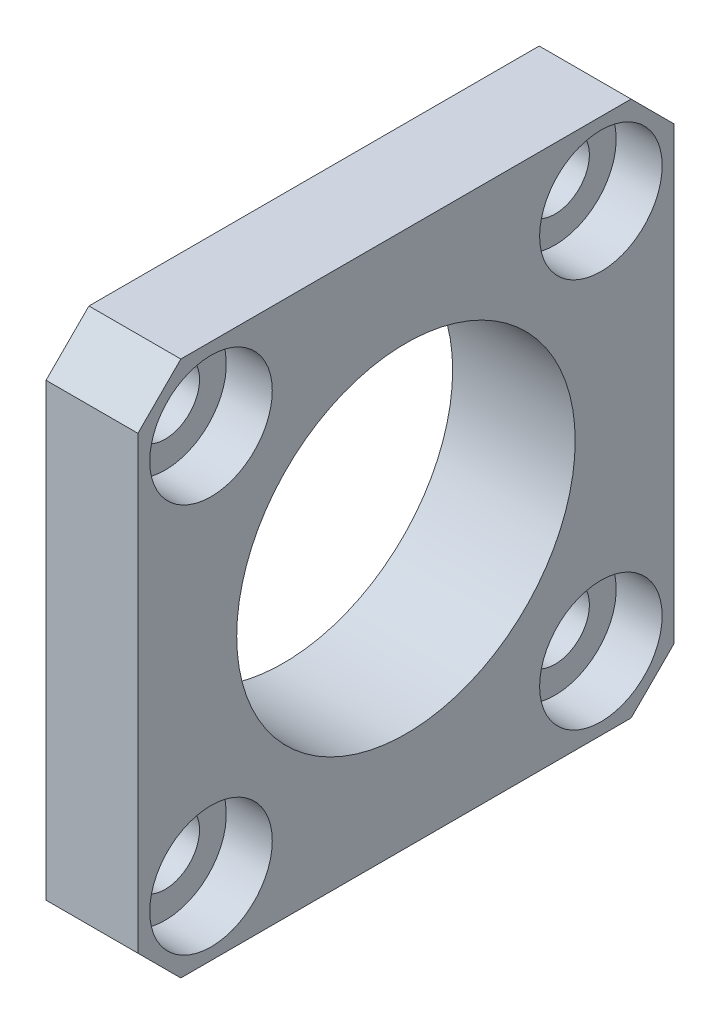
ISO-10303-21;
HEADER;
FILE_DESCRIPTION(('STEP AP214'),'2;1');
FILE_NAME('part.step','',(''),(''),'','','');
FILE_SCHEMA(('AUTOMOTIVE_DESIGN { 1 0 10303 214 1 1 1 1 }'));
ENDSEC;
DATA;
#1=APPLICATION_CONTEXT('core data for automotive mechanical design processes');
#2=APPLICATION_PROTOCOL_DEFINITION('international standard','automotive_design',2000,#1);
#3=PRODUCT_CONTEXT('',#1,'mechanical');
#4=PRODUCT('Part','Part','',(#3));
#5=PRODUCT_RELATED_PRODUCT_CATEGORY('part','',(#4));
#6=PRODUCT_DEFINITION_FORMATION('','',#4);
#7=PRODUCT_DEFINITION_CONTEXT('part definition',#1,'design');
#8=PRODUCT_DEFINITION('design','',#6,#7);
#9=PRODUCT_DEFINITION_SHAPE('','',#8);
#10=(LENGTH_UNIT() NAMED_UNIT(*) SI_UNIT(.MILLI.,.METRE.));
#11=(NAMED_UNIT(*) PLANE_ANGLE_UNIT() SI_UNIT($,.RADIAN.));
#12=(NAMED_UNIT(*) SI_UNIT($,.STERADIAN.) SOLID_ANGLE_UNIT());
#13=UNCERTAINTY_MEASURE_WITH_UNIT(LENGTH_MEASURE(1.E-05),#10,'distance_accuracy_value','');
#14=(GEOMETRIC_REPRESENTATION_CONTEXT(3) GLOBAL_UNCERTAINTY_ASSIGNED_CONTEXT((#13)) GLOBAL_UNIT_ASSIGNED_CONTEXT((#10,
#11,#12)) REPRESENTATION_CONTEXT('',''));
#15=CARTESIAN_POINT('',(0.,0.,0.));
#16=DIRECTION('',(0.,0.,1.));
#17=DIRECTION('',(1.,0.,0.));
#18=AXIS2_PLACEMENT_3D('',#15,#16,#17);
#19=CARTESIAN_POINT('',(6.,0.,0.));
#20=DIRECTION('',(1.,0.,0.));
#21=DIRECTION('',(0.,0.,-1.));
#22=AXIS2_PLACEMENT_3D('',#19,#20,#21);
#23=PLANE('',#22);
#24=CARTESIAN_POINT('',(6.,-12.7279220613581,-12.7279220613579));
#25=DIRECTION('',(1.,0.,0.));
#26=DIRECTION('',(0.,0.,-1.));
#27=AXIS2_PLACEMENT_3D('',#24,#25,#26);
#28=CIRCLE('',#27,4.);
#29=CARTESIAN_POINT('',(6.,-12.7279220613581,-16.7279220613579));
#30=VERTEX_POINT('',#29);
#31=EDGE_CURVE('E158',#30,#30,#28,.F.);
#32=ORIENTED_EDGE('',*,*,#31,.T.);
#33=EDGE_LOOP('',(#32));
#34=FACE_BOUND('',#33,.T.);
#35=CARTESIAN_POINT('',(6.,-12.7279220613581,12.7279220613581));
#36=DIRECTION('',(1.,0.,0.));
#37=DIRECTION('',(0.,0.,-1.));
#38=AXIS2_PLACEMENT_3D('',#35,#36,#37);
#39=CIRCLE('',#38,4.);
#40=CARTESIAN_POINT('',(6.,-12.7279220613581,8.7279220613581));
#41=VERTEX_POINT('',#40);
#42=EDGE_CURVE('E154',#41,#41,#39,.F.);
#43=ORIENTED_EDGE('',*,*,#42,.T.);
#44=EDGE_LOOP('',(#43));
#45=FACE_BOUND('',#44,.T.);
#46=CARTESIAN_POINT('',(6.,12.7279220613579,12.7279220613581));
#47=DIRECTION('',(1.,0.,0.));
#48=DIRECTION('',(0.,0.,-1.));
#49=AXIS2_PLACEMENT_3D('',#46,#47,#48);
#50=CIRCLE('',#49,4.);
#51=CARTESIAN_POINT('',(6.,12.7279220613579,8.72792206135814));
#52=VERTEX_POINT('',#51);
#53=EDGE_CURVE('E150',#52,#52,#50,.F.);
#54=ORIENTED_EDGE('',*,*,#53,.T.);
#55=EDGE_LOOP('',(#54));
#56=FACE_BOUND('',#55,.T.);
#57=CARTESIAN_POINT('',(6.,12.7279220613579,-12.7279220613579));
#58=DIRECTION('',(1.,0.,0.));
#59=DIRECTION('',(0.,0.,-1.));
#60=AXIS2_PLACEMENT_3D('',#57,#58,#59);
#61=CIRCLE('',#60,4.);
#62=CARTESIAN_POINT('',(6.,12.7279220613579,-16.7279220613579));
#63=VERTEX_POINT('',#62);
#64=EDGE_CURVE('E145',#63,#63,#61,.F.);
#65=ORIENTED_EDGE('',*,*,#64,.T.);
#66=EDGE_LOOP('',(#65));
#67=FACE_BOUND('',#66,.T.);
#68=CARTESIAN_POINT('',(6.,0.,0.));
#69=DIRECTION('',(-1.,0.,0.));
#70=DIRECTION('',(0.,0.,1.));
#71=AXIS2_PLACEMENT_3D('',#68,#69,#70);
#72=CIRCLE('',#71,11.05);
#73=CARTESIAN_POINT('',(6.,0.,11.05));
#74=VERTEX_POINT('',#73);
#75=EDGE_CURVE('E148',#74,#74,#72,.T.);
#76=ORIENTED_EDGE('',*,*,#75,.T.);
#77=EDGE_LOOP('',(#76));
#78=FACE_BOUND('',#77,.T.);
#79=DIRECTION('',(0.,-1.,0.));
#80=VECTOR('',#79,1.);
#81=CARTESIAN_POINT('',(6.,14.7,17.5));
#82=LINE('',#81,#80);
#83=CARTESIAN_POINT('',(6.,14.7,17.5));
#84=VERTEX_POINT('',#83);
#85=CARTESIAN_POINT('',(6.,-14.7,17.5));
#86=VERTEX_POINT('',#85);
#87=EDGE_CURVE('E131',#84,#86,#82,.T.);
#88=ORIENTED_EDGE('',*,*,#87,.T.);
#89=DIRECTION('',(0.,-0.707106781186548,-0.707106781186548));
#90=VECTOR('',#89,1.);
#91=CARTESIAN_POINT('',(6.,-14.7,17.5));
#92=LINE('',#91,#90);
#93=CARTESIAN_POINT('',(6.,-17.5,14.7));
#94=VERTEX_POINT('',#93);
#95=EDGE_CURVE('E80',#86,#94,#92,.T.);
#96=ORIENTED_EDGE('',*,*,#95,.T.);
#97=DIRECTION('',(0.,0.,-1.));
#98=VECTOR('',#97,1.);
#99=CARTESIAN_POINT('',(6.,-17.5,14.7));
#100=LINE('',#99,#98);
#101=CARTESIAN_POINT('',(6.,-17.5,-14.7));
#102=VERTEX_POINT('',#101);
#103=EDGE_CURVE('E195',#94,#102,#100,.T.);
#104=ORIENTED_EDGE('',*,*,#103,.T.);
#105=DIRECTION('',(0.,0.707106781186548,-0.707106781186548));
#106=VECTOR('',#105,1.);
#107=CARTESIAN_POINT('',(6.,-17.5,-14.7));
#108=LINE('',#107,#106);
#109=CARTESIAN_POINT('',(6.,-14.7,-17.5));
#110=VERTEX_POINT('',#109);
#111=EDGE_CURVE('E197',#102,#110,#108,.T.);
#112=ORIENTED_EDGE('',*,*,#111,.T.);
#113=DIRECTION('',(0.,1.,0.));
#114=VECTOR('',#113,1.);
#115=CARTESIAN_POINT('',(6.,-14.7,-17.5));
#116=LINE('',#115,#114);
#117=CARTESIAN_POINT('',(6.,14.7,-17.5));
#118=VERTEX_POINT('',#117);
#119=EDGE_CURVE('E98',#110,#118,#116,.T.);
#120=ORIENTED_EDGE('',*,*,#119,.T.);
#121=DIRECTION('',(0.,0.707106781186548,0.707106781186548));
#122=VECTOR('',#121,1.);
#123=CARTESIAN_POINT('',(6.,14.7,-17.5));
#124=LINE('',#123,#122);
#125=CARTESIAN_POINT('',(6.,17.5,-14.7));
#126=VERTEX_POINT('',#125);
#127=EDGE_CURVE('E93',#118,#126,#124,.T.);
#128=ORIENTED_EDGE('',*,*,#127,.T.);
#129=DIRECTION('',(0.,0.,1.));
#130=VECTOR('',#129,1.);
#131=CARTESIAN_POINT('',(6.,17.5,-14.7));
#132=LINE('',#131,#130);
#133=CARTESIAN_POINT('',(6.,17.5,14.7));
#134=VERTEX_POINT('',#133);
#135=EDGE_CURVE('E96',#126,#134,#132,.T.);
#136=ORIENTED_EDGE('',*,*,#135,.T.);
#137=DIRECTION('',(0.,-0.707106781186548,0.707106781186548));
#138=VECTOR('',#137,1.);
#139=CARTESIAN_POINT('',(6.,17.5,14.7));
#140=LINE('',#139,#138);
#141=EDGE_CURVE('E36',#134,#84,#140,.T.);
#142=ORIENTED_EDGE('',*,*,#141,.T.);
#143=EDGE_LOOP('',(#88,#96,#104,#112,#120,#128,#136,#142));
#144=FACE_BOUND('',#143,.T.);
#145=ADVANCED_FACE('F17',(#34,#45,#56,#67,#78,#144),#23,.T.);
#146=CARTESIAN_POINT('',(0.,0.,0.));
#147=DIRECTION('',(1.,0.,0.));
#148=DIRECTION('',(0.,0.,-1.));
#149=AXIS2_PLACEMENT_3D('',#146,#147,#148);
#150=PLANE('',#149);
#151=CARTESIAN_POINT('',(0.,12.7279220613579,12.7279220613581));
#152=DIRECTION('',(1.,0.,0.));
#153=DIRECTION('',(0.,0.,-1.));
#154=AXIS2_PLACEMENT_3D('',#151,#152,#153);
#155=CIRCLE('',#154,2.25);
#156=CARTESIAN_POINT('',(0.,12.7279220613579,10.4779220613581));
#157=VERTEX_POINT('',#156);
#158=EDGE_CURVE('E302',#157,#157,#155,.T.);
#159=ORIENTED_EDGE('',*,*,#158,.T.);
#160=EDGE_LOOP('',(#159));
#161=FACE_BOUND('',#160,.T.);
#162=CARTESIAN_POINT('',(0.,12.7279220613579,-12.7279220613579));
#163=DIRECTION('',(1.,0.,0.));
#164=DIRECTION('',(0.,0.,-1.));
#165=AXIS2_PLACEMENT_3D('',#162,#163,#164);
#166=CIRCLE('',#165,2.25);
#167=CARTESIAN_POINT('',(0.,12.7279220613579,-14.9779220613579));
#168=VERTEX_POINT('',#167);
#169=EDGE_CURVE('E21',#168,#168,#166,.T.);
#170=ORIENTED_EDGE('',*,*,#169,.T.);
#171=EDGE_LOOP('',(#170));
#172=FACE_BOUND('',#171,.T.);
#173=CARTESIAN_POINT('',(0.,-12.7279220613581,12.7279220613581));
#174=DIRECTION('',(1.,0.,0.));
#175=DIRECTION('',(0.,0.,-1.));
#176=AXIS2_PLACEMENT_3D('',#173,#174,#175);
#177=CIRCLE('',#176,2.25);
#178=CARTESIAN_POINT('',(0.,-12.7279220613581,10.4779220613581));
#179=VERTEX_POINT('',#178);
#180=EDGE_CURVE('E161',#179,#179,#177,.T.);
#181=ORIENTED_EDGE('',*,*,#180,.T.);
#182=EDGE_LOOP('',(#181));
#183=FACE_BOUND('',#182,.T.);
#184=CARTESIAN_POINT('',(0.,-12.7279220613581,-12.7279220613579));
#185=DIRECTION('',(1.,0.,0.));
#186=DIRECTION('',(0.,0.,-1.));
#187=AXIS2_PLACEMENT_3D('',#184,#185,#186);
#188=CIRCLE('',#187,2.25);
#189=CARTESIAN_POINT('',(0.,-12.7279220613581,-14.9779220613579));
#190=VERTEX_POINT('',#189);
#191=EDGE_CURVE('E168',#190,#190,#188,.T.);
#192=ORIENTED_EDGE('',*,*,#191,.T.);
#193=EDGE_LOOP('',(#192));
#194=FACE_BOUND('',#193,.T.);
#195=CARTESIAN_POINT('',(0.,0.,0.));
#196=DIRECTION('',(-1.,0.,0.));
#197=DIRECTION('',(0.,0.,1.));
#198=AXIS2_PLACEMENT_3D('',#195,#196,#197);
#199=CIRCLE('',#198,13.);
#200=CARTESIAN_POINT('',(0.,0.,13.));
#201=VERTEX_POINT('',#200);
#202=EDGE_CURVE('E11',#201,#201,#199,.T.);
#203=ORIENTED_EDGE('',*,*,#202,.F.);
#204=EDGE_LOOP('',(#203));
#205=FACE_BOUND('',#204,.T.);
#206=DIRECTION('',(0.,-1.,0.));
#207=VECTOR('',#206,1.);
#208=CARTESIAN_POINT('',(0.,14.7,17.5));
#209=LINE('',#208,#207);
#210=CARTESIAN_POINT('',(0.,14.7,17.5));
#211=VERTEX_POINT('',#210);
#212=CARTESIAN_POINT('',(0.,-14.7,17.5));
#213=VERTEX_POINT('',#212);
#214=EDGE_CURVE('E116',#211,#213,#209,.T.);
#215=ORIENTED_EDGE('',*,*,#214,.F.);
#216=DIRECTION('',(0.,-0.707106781186548,0.707106781186548));
#217=VECTOR('',#216,1.);
#218=CARTESIAN_POINT('',(0.,17.5,14.7));
#219=LINE('',#218,#217);
#220=CARTESIAN_POINT('',(0.,17.5,14.7));
#221=VERTEX_POINT('',#220);
#222=EDGE_CURVE('E71',#221,#211,#219,.T.);
#223=ORIENTED_EDGE('',*,*,#222,.F.);
#224=DIRECTION('',(0.,0.,1.));
#225=VECTOR('',#224,1.);
#226=CARTESIAN_POINT('',(0.,17.5,-14.7));
#227=LINE('',#226,#225);
#228=CARTESIAN_POINT('',(0.,17.5,-14.7));
#229=VERTEX_POINT('',#228);
#230=EDGE_CURVE('E65',#229,#221,#227,.T.);
#231=ORIENTED_EDGE('',*,*,#230,.F.);
#232=DIRECTION('',(0.,0.707106781186548,0.707106781186548));
#233=VECTOR('',#232,1.);
#234=CARTESIAN_POINT('',(0.,14.7,-17.5));
#235=LINE('',#234,#233);
#236=CARTESIAN_POINT('',(0.,14.7,-17.5));
#237=VERTEX_POINT('',#236);
#238=EDGE_CURVE('E106',#237,#229,#235,.T.);
#239=ORIENTED_EDGE('',*,*,#238,.F.);
#240=DIRECTION('',(0.,1.,0.));
#241=VECTOR('',#240,1.);
#242=CARTESIAN_POINT('',(0.,-14.7,-17.5));
#243=LINE('',#242,#241);
#244=CARTESIAN_POINT('',(0.,-14.7,-17.5));
#245=VERTEX_POINT('',#244);
#246=EDGE_CURVE('E126',#245,#237,#243,.T.);
#247=ORIENTED_EDGE('',*,*,#246,.F.);
#248=DIRECTION('',(0.,0.707106781186548,-0.707106781186548));
#249=VECTOR('',#248,1.);
#250=CARTESIAN_POINT('',(0.,-17.5,-14.7));
#251=LINE('',#250,#249);
#252=CARTESIAN_POINT('',(0.,-17.5,-14.7));
#253=VERTEX_POINT('',#252);
#254=EDGE_CURVE('E124',#253,#245,#251,.T.);
#255=ORIENTED_EDGE('',*,*,#254,.F.);
#256=DIRECTION('',(0.,0.,-1.));
#257=VECTOR('',#256,1.);
#258=CARTESIAN_POINT('',(0.,-17.5,14.7));
#259=LINE('',#258,#257);
#260=CARTESIAN_POINT('',(0.,-17.5,14.7));
#261=VERTEX_POINT('',#260);
#262=EDGE_CURVE('E122',#261,#253,#259,.T.);
#263=ORIENTED_EDGE('',*,*,#262,.F.);
#264=DIRECTION('',(0.,-0.707106781186548,-0.707106781186548));
#265=VECTOR('',#264,1.);
#266=CARTESIAN_POINT('',(0.,-14.7,17.5));
#267=LINE('',#266,#265);
#268=EDGE_CURVE('E119',#213,#261,#267,.T.);
#269=ORIENTED_EDGE('',*,*,#268,.F.);
#270=EDGE_LOOP('',(#215,#223,#231,#239,#247,#255,#263,#269));
#271=FACE_BOUND('',#270,.T.);
#272=ADVANCED_FACE('F210',(#161,#172,#183,#194,#205,#271),#150,.F.);
#273=CARTESIAN_POINT('',(6.,14.7,17.5));
#274=DIRECTION('',(0.,0.,-1.));
#275=DIRECTION('',(-1.,0.,0.));
#276=AXIS2_PLACEMENT_3D('',#273,#274,#275);
#277=PLANE('',#276);
#278=ORIENTED_EDGE('',*,*,#214,.T.);
#279=DIRECTION('',(-1.,0.,0.));
#280=VECTOR('',#279,1.);
#281=CARTESIAN_POINT('',(6.,-14.7,17.5));
#282=LINE('',#281,#280);
#283=EDGE_CURVE('E27',#86,#213,#282,.T.);
#284=ORIENTED_EDGE('',*,*,#283,.F.);
#285=ORIENTED_EDGE('',*,*,#87,.F.);
#286=DIRECTION('',(-1.,0.,0.));
#287=VECTOR('',#286,1.);
#288=CARTESIAN_POINT('',(6.,14.7,17.5));
#289=LINE('',#288,#287);
#290=EDGE_CURVE('E112',#84,#211,#289,.T.);
#291=ORIENTED_EDGE('',*,*,#290,.T.);
#292=EDGE_LOOP('',(#278,#284,#285,#291));
#293=FACE_BOUND('',#292,.T.);
#294=ADVANCED_FACE('F19',(#293),#277,.F.);
#295=CARTESIAN_POINT('',(6.,-14.7,17.5));
#296=DIRECTION('',(0.,0.707106781186548,-0.707106781186548));
#297=DIRECTION('',(0.,0.707106781186548,0.707106781186548));
#298=AXIS2_PLACEMENT_3D('',#295,#296,#297);
#299=PLANE('',#298);
#300=ORIENTED_EDGE('',*,*,#268,.T.);
#301=DIRECTION('',(-1.,0.,0.));
#302=VECTOR('',#301,1.);
#303=CARTESIAN_POINT('',(6.,-17.5,14.7));
#304=LINE('',#303,#302);
#305=EDGE_CURVE('E141',#94,#261,#304,.T.);
#306=ORIENTED_EDGE('',*,*,#305,.F.);
#307=ORIENTED_EDGE('',*,*,#95,.F.);
#308=ORIENTED_EDGE('',*,*,#283,.T.);
#309=EDGE_LOOP('',(#300,#306,#307,#308));
#310=FACE_BOUND('',#309,.T.);
#311=ADVANCED_FACE('F446',(#310),#299,.F.);
#312=CARTESIAN_POINT('',(6.,-17.5,14.7));
#313=DIRECTION('',(0.,1.,0.));
#314=DIRECTION('',(0.,0.,1.));
#315=AXIS2_PLACEMENT_3D('',#312,#313,#314);
#316=PLANE('',#315);
#317=ORIENTED_EDGE('',*,*,#262,.T.);
#318=DIRECTION('',(-1.,0.,0.));
#319=VECTOR('',#318,1.);
#320=CARTESIAN_POINT('',(6.,-17.5,-14.7));
#321=LINE('',#320,#319);
#322=EDGE_CURVE('E138',#102,#253,#321,.T.);
#323=ORIENTED_EDGE('',*,*,#322,.F.);
#324=ORIENTED_EDGE('',*,*,#103,.F.);
#325=ORIENTED_EDGE('',*,*,#305,.T.);
#326=EDGE_LOOP('',(#317,#323,#324,#325));
#327=FACE_BOUND('',#326,.T.);
#328=ADVANCED_FACE('F437',(#327),#316,.F.);
#329=CARTESIAN_POINT('',(6.,-17.5,-14.7));
#330=DIRECTION('',(0.,0.707106781186548,0.707106781186548));
#331=DIRECTION('',(0.,-0.707106781186548,0.707106781186548));
#332=AXIS2_PLACEMENT_3D('',#329,#330,#331);
#333=PLANE('',#332);
#334=ORIENTED_EDGE('',*,*,#254,.T.);
#335=DIRECTION('',(-1.,0.,0.));
#336=VECTOR('',#335,1.);
#337=CARTESIAN_POINT('',(6.,-14.7,-17.5));
#338=LINE('',#337,#336);
#339=EDGE_CURVE('E135',#110,#245,#338,.T.);
#340=ORIENTED_EDGE('',*,*,#339,.F.);
#341=ORIENTED_EDGE('',*,*,#111,.F.);
#342=ORIENTED_EDGE('',*,*,#322,.T.);
#343=EDGE_LOOP('',(#334,#340,#341,#342));
#344=FACE_BOUND('',#343,.T.);
#345=ADVANCED_FACE('F203',(#344),#333,.F.);
#346=CARTESIAN_POINT('',(6.,-14.7,-17.5));
#347=DIRECTION('',(0.,0.,1.));
#348=DIRECTION('',(1.,0.,0.));
#349=AXIS2_PLACEMENT_3D('',#346,#347,#348);
#350=PLANE('',#349);
#351=ORIENTED_EDGE('',*,*,#246,.T.);
#352=DIRECTION('',(-1.,0.,0.));
#353=VECTOR('',#352,1.);
#354=CARTESIAN_POINT('',(6.,14.7,-17.5));
#355=LINE('',#354,#353);
#356=EDGE_CURVE('E107',#118,#237,#355,.T.);
#357=ORIENTED_EDGE('',*,*,#356,.F.);
#358=ORIENTED_EDGE('',*,*,#119,.F.);
#359=ORIENTED_EDGE('',*,*,#339,.T.);
#360=EDGE_LOOP('',(#351,#357,#358,#359));
#361=FACE_BOUND('',#360,.T.);
#362=ADVANCED_FACE('F207',(#361),#350,.F.);
#363=CARTESIAN_POINT('',(6.,14.7,-17.5));
#364=DIRECTION('',(0.,-0.707106781186548,0.707106781186548));
#365=DIRECTION('',(0.,-0.707106781186548,-0.707106781186548));
#366=AXIS2_PLACEMENT_3D('',#363,#364,#365);
#367=PLANE('',#366);
#368=ORIENTED_EDGE('',*,*,#238,.T.);
#369=DIRECTION('',(-1.,0.,0.));
#370=VECTOR('',#369,1.);
#371=CARTESIAN_POINT('',(6.,17.5,-14.7));
#372=LINE('',#371,#370);
#373=EDGE_CURVE('E103',#126,#229,#372,.T.);
#374=ORIENTED_EDGE('',*,*,#373,.F.);
#375=ORIENTED_EDGE('',*,*,#127,.F.);
#376=ORIENTED_EDGE('',*,*,#356,.T.);
#377=EDGE_LOOP('',(#368,#374,#375,#376));
#378=FACE_BOUND('',#377,.T.);
#379=ADVANCED_FACE('F104',(#378),#367,.F.);
#380=CARTESIAN_POINT('',(6.,17.5,-14.7));
#381=DIRECTION('',(0.,-1.,0.));
#382=DIRECTION('',(0.,0.,-1.));
#383=AXIS2_PLACEMENT_3D('',#380,#381,#382);
#384=PLANE('',#383);
#385=ORIENTED_EDGE('',*,*,#230,.T.);
#386=DIRECTION('',(-1.,0.,0.));
#387=VECTOR('',#386,1.);
#388=CARTESIAN_POINT('',(6.,17.5,14.7));
#389=LINE('',#388,#387);
#390=EDGE_CURVE('E108',#134,#221,#389,.T.);
#391=ORIENTED_EDGE('',*,*,#390,.F.);
#392=ORIENTED_EDGE('',*,*,#135,.F.);
#393=ORIENTED_EDGE('',*,*,#373,.T.);
#394=EDGE_LOOP('',(#385,#391,#392,#393));
#395=FACE_BOUND('',#394,.T.);
#396=ADVANCED_FACE('F110',(#395),#384,.F.);
#397=CARTESIAN_POINT('',(6.,17.5,14.7));
#398=DIRECTION('',(0.,-0.707106781186548,-0.707106781186548));
#399=DIRECTION('',(0.,0.707106781186548,-0.707106781186548));
#400=AXIS2_PLACEMENT_3D('',#397,#398,#399);
#401=PLANE('',#400);
#402=ORIENTED_EDGE('',*,*,#222,.T.);
#403=ORIENTED_EDGE('',*,*,#290,.F.);
#404=ORIENTED_EDGE('',*,*,#141,.F.);
#405=ORIENTED_EDGE('',*,*,#390,.T.);
#406=EDGE_LOOP('',(#402,#403,#404,#405));
#407=FACE_BOUND('',#406,.T.);
#408=ADVANCED_FACE('F215',(#407),#401,.F.);
#409=CARTESIAN_POINT('',(10.,0.,0.));
#410=DIRECTION('',(-1.,0.,0.));
#411=DIRECTION('',(0.,0.,1.));
#412=AXIS2_PLACEMENT_3D('',#409,#410,#411);
#413=CYLINDRICAL_SURFACE('',#412,13.);
#414=CARTESIAN_POINT('',(-2.,0.,0.));
#415=DIRECTION('',(-1.,0.,0.));
#416=DIRECTION('',(0.,0.,1.));
#417=AXIS2_PLACEMENT_3D('',#414,#415,#416);
#418=CIRCLE('',#417,13.);
#419=CARTESIAN_POINT('',(-2.,0.,13.));
#420=VERTEX_POINT('',#419);
#421=EDGE_CURVE('E120',#420,#420,#418,.T.);
#422=ORIENTED_EDGE('',*,*,#421,.F.);
#423=EDGE_LOOP('',(#422));
#424=FACE_BOUND('',#423,.T.);
#425=ORIENTED_EDGE('',*,*,#202,.T.);
#426=EDGE_LOOP('',(#425));
#427=FACE_BOUND('',#426,.T.);
#428=ADVANCED_FACE('F217',(#424,#427),#413,.T.);
#429=CARTESIAN_POINT('',(-2.,13.,0.));
#430=DIRECTION('',(1.,0.,0.));
#431=DIRECTION('',(0.,0.,-1.));
#432=AXIS2_PLACEMENT_3D('',#429,#430,#431);
#433=PLANE('',#432);
#434=CARTESIAN_POINT('',(-2.,0.,0.));
#435=DIRECTION('',(1.,0.,0.));
#436=DIRECTION('',(0.,0.,-1.));
#437=AXIS2_PLACEMENT_3D('',#434,#435,#436);
#438=CIRCLE('',#437,11.05);
#439=CARTESIAN_POINT('',(-2.,0.,-11.05));
#440=VERTEX_POINT('',#439);
#441=EDGE_CURVE('E304',#440,#440,#438,.T.);
#442=ORIENTED_EDGE('',*,*,#441,.T.);
#443=EDGE_LOOP('',(#442));
#444=FACE_BOUND('',#443,.T.);
#445=ORIENTED_EDGE('',*,*,#421,.T.);
#446=EDGE_LOOP('',(#445));
#447=FACE_BOUND('',#446,.T.);
#448=ADVANCED_FACE('F225',(#444,#447),#433,.F.);
#449=CARTESIAN_POINT('',(6.,0.,0.));
#450=DIRECTION('',(-1.,0.,0.));
#451=DIRECTION('',(0.,0.,1.));
#452=AXIS2_PLACEMENT_3D('',#449,#450,#451);
#453=CYLINDRICAL_SURFACE('',#452,11.05);
#454=ORIENTED_EDGE('',*,*,#75,.F.);
#455=EDGE_LOOP('',(#454));
#456=FACE_BOUND('',#455,.T.);
#457=ORIENTED_EDGE('',*,*,#441,.F.);
#458=EDGE_LOOP('',(#457));
#459=FACE_BOUND('',#458,.T.);
#460=ADVANCED_FACE('F242',(#456,#459),#453,.F.);
#461=CARTESIAN_POINT('',(3.,15.2027957955108,-15.2027957955109));
#462=DIRECTION('',(1.,0.,0.));
#463=DIRECTION('',(0.,0.,-1.));
#464=AXIS2_PLACEMENT_3D('',#461,#462,#463);
#465=PLANE('',#464);
#466=CARTESIAN_POINT('',(3.,12.7279220613579,-12.7279220613579));
#467=DIRECTION('',(1.,0.,0.));
#468=DIRECTION('',(0.,0.,-1.));
#469=AXIS2_PLACEMENT_3D('',#466,#467,#468);
#470=CIRCLE('',#469,2.25);
#471=CARTESIAN_POINT('',(3.,12.7279220613579,-14.9779220613579));
#472=VERTEX_POINT('',#471);
#473=EDGE_CURVE('E175',#472,#472,#470,.T.);
#474=ORIENTED_EDGE('',*,*,#473,.F.);
#475=EDGE_LOOP('',(#474));
#476=FACE_BOUND('',#475,.T.);
#477=CARTESIAN_POINT('',(3.,12.7279220613579,-12.7279220613579));
#478=DIRECTION('',(-1.,0.,0.));
#479=DIRECTION('',(0.,0.,1.));
#480=AXIS2_PLACEMENT_3D('',#477,#478,#479);
#481=CIRCLE('',#480,4.);
#482=CARTESIAN_POINT('',(3.,12.7279220613579,-8.7279220613579));
#483=VERTEX_POINT('',#482);
#484=EDGE_CURVE('E149',#483,#483,#481,.T.);
#485=ORIENTED_EDGE('',*,*,#484,.F.);
#486=EDGE_LOOP('',(#485));
#487=FACE_BOUND('',#486,.T.);
#488=ADVANCED_FACE('F246',(#476,#487),#465,.T.);
#489=CARTESIAN_POINT('',(7.,12.7279220613579,-12.7279220613579));
#490=DIRECTION('',(-1.,0.,0.));
#491=DIRECTION('',(0.,0.,1.));
#492=AXIS2_PLACEMENT_3D('',#489,#490,#491);
#493=CYLINDRICAL_SURFACE('',#492,4.);
#494=ORIENTED_EDGE('',*,*,#64,.F.);
#495=EDGE_LOOP('',(#494));
#496=FACE_BOUND('',#495,.T.);
#497=ORIENTED_EDGE('',*,*,#484,.T.);
#498=EDGE_LOOP('',(#497));
#499=FACE_BOUND('',#498,.T.);
#500=ADVANCED_FACE('F250',(#496,#499),#493,.F.);
#501=CARTESIAN_POINT('',(3.,15.2027957955109,10.2530483272052));
#502=DIRECTION('',(1.,0.,0.));
#503=DIRECTION('',(0.,0.,-1.));
#504=AXIS2_PLACEMENT_3D('',#501,#502,#503);
#505=PLANE('',#504);
#506=CARTESIAN_POINT('',(3.,12.7279220613579,12.7279220613581));
#507=DIRECTION('',(1.,0.,0.));
#508=DIRECTION('',(0.,0.,-1.));
#509=AXIS2_PLACEMENT_3D('',#506,#507,#508);
#510=CIRCLE('',#509,2.25);
#511=CARTESIAN_POINT('',(3.,12.7279220613579,10.4779220613581));
#512=VERTEX_POINT('',#511);
#513=EDGE_CURVE('E299',#512,#512,#510,.T.);
#514=ORIENTED_EDGE('',*,*,#513,.F.);
#515=EDGE_LOOP('',(#514));
#516=FACE_BOUND('',#515,.T.);
#517=CARTESIAN_POINT('',(3.,12.7279220613579,12.7279220613581));
#518=DIRECTION('',(-1.,0.,0.));
#519=DIRECTION('',(0.,0.,1.));
#520=AXIS2_PLACEMENT_3D('',#517,#518,#519);
#521=CIRCLE('',#520,4.);
#522=CARTESIAN_POINT('',(3.,12.7279220613579,16.7279220613581));
#523=VERTEX_POINT('',#522);
#524=EDGE_CURVE('E153',#523,#523,#521,.T.);
#525=ORIENTED_EDGE('',*,*,#524,.F.);
#526=EDGE_LOOP('',(#525));
#527=FACE_BOUND('',#526,.T.);
#528=ADVANCED_FACE('F254',(#516,#527),#505,.T.);
#529=CARTESIAN_POINT('',(7.,12.7279220613579,12.7279220613581));
#530=DIRECTION('',(-1.,0.,0.));
#531=DIRECTION('',(0.,0.,1.));
#532=AXIS2_PLACEMENT_3D('',#529,#530,#531);
#533=CYLINDRICAL_SURFACE('',#532,4.);
#534=ORIENTED_EDGE('',*,*,#53,.F.);
#535=EDGE_LOOP('',(#534));
#536=FACE_BOUND('',#535,.T.);
#537=ORIENTED_EDGE('',*,*,#524,.T.);
#538=EDGE_LOOP('',(#537));
#539=FACE_BOUND('',#538,.T.);
#540=ADVANCED_FACE('F258',(#536,#539),#533,.F.);
#541=CARTESIAN_POINT('',(3.,-10.2530483272052,10.2530483272052));
#542=DIRECTION('',(1.,0.,0.));
#543=DIRECTION('',(0.,0.,-1.));
#544=AXIS2_PLACEMENT_3D('',#541,#542,#543);
#545=PLANE('',#544);
#546=CARTESIAN_POINT('',(3.,-12.7279220613581,12.7279220613581));
#547=DIRECTION('',(1.,0.,0.));
#548=DIRECTION('',(0.,0.,-1.));
#549=AXIS2_PLACEMENT_3D('',#546,#547,#548);
#550=CIRCLE('',#549,2.25);
#551=CARTESIAN_POINT('',(3.,-12.7279220613581,10.4779220613581));
#552=VERTEX_POINT('',#551);
#553=EDGE_CURVE('E164',#552,#552,#550,.T.);
#554=ORIENTED_EDGE('',*,*,#553,.F.);
#555=EDGE_LOOP('',(#554));
#556=FACE_BOUND('',#555,.T.);
#557=CARTESIAN_POINT('',(3.,-12.7279220613581,12.7279220613581));
#558=DIRECTION('',(-1.,0.,0.));
#559=DIRECTION('',(0.,0.,1.));
#560=AXIS2_PLACEMENT_3D('',#557,#558,#559);
#561=CIRCLE('',#560,4.);
#562=CARTESIAN_POINT('',(3.,-12.7279220613581,16.7279220613581));
#563=VERTEX_POINT('',#562);
#564=EDGE_CURVE('E157',#563,#563,#561,.T.);
#565=ORIENTED_EDGE('',*,*,#564,.F.);
#566=EDGE_LOOP('',(#565));
#567=FACE_BOUND('',#566,.T.);
#568=ADVANCED_FACE('F262',(#556,#567),#545,.T.);
#569=CARTESIAN_POINT('',(7.,-12.7279220613581,12.7279220613581));
#570=DIRECTION('',(-1.,0.,0.));
#571=DIRECTION('',(0.,0.,1.));
#572=AXIS2_PLACEMENT_3D('',#569,#570,#571);
#573=CYLINDRICAL_SURFACE('',#572,4.);
#574=ORIENTED_EDGE('',*,*,#42,.F.);
#575=EDGE_LOOP('',(#574));
#576=FACE_BOUND('',#575,.T.);
#577=ORIENTED_EDGE('',*,*,#564,.T.);
#578=EDGE_LOOP('',(#577));
#579=FACE_BOUND('',#578,.T.);
#580=ADVANCED_FACE('F266',(#576,#579),#573,.F.);
#581=CARTESIAN_POINT('',(3.,-10.2530483272052,-15.2027957955109));
#582=DIRECTION('',(1.,0.,0.));
#583=DIRECTION('',(0.,0.,-1.));
#584=AXIS2_PLACEMENT_3D('',#581,#582,#583);
#585=PLANE('',#584);
#586=CARTESIAN_POINT('',(3.,-12.7279220613581,-12.7279220613579));
#587=DIRECTION('',(1.,0.,0.));
#588=DIRECTION('',(0.,0.,-1.));
#589=AXIS2_PLACEMENT_3D('',#586,#587,#588);
#590=CIRCLE('',#589,2.25);
#591=CARTESIAN_POINT('',(3.,-12.7279220613581,-14.9779220613579));
#592=VERTEX_POINT('',#591);
#593=EDGE_CURVE('E163',#592,#592,#590,.T.);
#594=ORIENTED_EDGE('',*,*,#593,.F.);
#595=EDGE_LOOP('',(#594));
#596=FACE_BOUND('',#595,.T.);
#597=CARTESIAN_POINT('',(3.,-12.7279220613581,-12.7279220613579));
#598=DIRECTION('',(-1.,0.,0.));
#599=DIRECTION('',(0.,0.,1.));
#600=AXIS2_PLACEMENT_3D('',#597,#598,#599);
#601=CIRCLE('',#600,4.);
#602=CARTESIAN_POINT('',(3.,-12.7279220613581,-8.72792206135792));
#603=VERTEX_POINT('',#602);
#604=EDGE_CURVE('E160',#603,#603,#601,.T.);
#605=ORIENTED_EDGE('',*,*,#604,.F.);
#606=EDGE_LOOP('',(#605));
#607=FACE_BOUND('',#606,.T.);
#608=ADVANCED_FACE('F270',(#596,#607),#585,.T.);
#609=CARTESIAN_POINT('',(7.,-12.7279220613581,-12.7279220613579));
#610=DIRECTION('',(-1.,0.,0.));
#611=DIRECTION('',(0.,0.,1.));
#612=AXIS2_PLACEMENT_3D('',#609,#610,#611);
#613=CYLINDRICAL_SURFACE('',#612,4.);
#614=ORIENTED_EDGE('',*,*,#31,.F.);
#615=EDGE_LOOP('',(#614));
#616=FACE_BOUND('',#615,.T.);
#617=ORIENTED_EDGE('',*,*,#604,.T.);
#618=EDGE_LOOP('',(#617));
#619=FACE_BOUND('',#618,.T.);
#620=ADVANCED_FACE('F274',(#616,#619),#613,.F.);
#621=CARTESIAN_POINT('',(3.,-12.7279220613581,-12.7279220613579));
#622=DIRECTION('',(1.,0.,0.));
#623=DIRECTION('',(0.,0.,-1.));
#624=AXIS2_PLACEMENT_3D('',#621,#622,#623);
#625=CYLINDRICAL_SURFACE('',#624,2.25);
#626=ORIENTED_EDGE('',*,*,#593,.T.);
#627=EDGE_LOOP('',(#626));
#628=FACE_BOUND('',#627,.T.);
#629=ORIENTED_EDGE('',*,*,#191,.F.);
#630=EDGE_LOOP('',(#629));
#631=FACE_BOUND('',#630,.T.);
#632=ADVANCED_FACE('F278',(#628,#631),#625,.F.);
#633=CARTESIAN_POINT('',(3.,-12.7279220613581,12.7279220613581));
#634=DIRECTION('',(1.,0.,0.));
#635=DIRECTION('',(0.,0.,-1.));
#636=AXIS2_PLACEMENT_3D('',#633,#634,#635);
#637=CYLINDRICAL_SURFACE('',#636,2.25);
#638=ORIENTED_EDGE('',*,*,#553,.T.);
#639=EDGE_LOOP('',(#638));
#640=FACE_BOUND('',#639,.T.);
#641=ORIENTED_EDGE('',*,*,#180,.F.);
#642=EDGE_LOOP('',(#641));
#643=FACE_BOUND('',#642,.T.);
#644=ADVANCED_FACE('F282',(#640,#643),#637,.F.);
#645=CARTESIAN_POINT('',(3.,12.7279220613579,-12.7279220613579));
#646=DIRECTION('',(1.,0.,0.));
#647=DIRECTION('',(0.,0.,-1.));
#648=AXIS2_PLACEMENT_3D('',#645,#646,#647);
#649=CYLINDRICAL_SURFACE('',#648,2.25);
#650=ORIENTED_EDGE('',*,*,#473,.T.);
#651=EDGE_LOOP('',(#650));
#652=FACE_BOUND('',#651,.T.);
#653=ORIENTED_EDGE('',*,*,#169,.F.);
#654=EDGE_LOOP('',(#653));
#655=FACE_BOUND('',#654,.T.);
#656=ADVANCED_FACE('F286',(#652,#655),#649,.F.);
#657=CARTESIAN_POINT('',(3.,12.7279220613579,12.7279220613581));
#658=DIRECTION('',(1.,0.,0.));
#659=DIRECTION('',(0.,0.,-1.));
#660=AXIS2_PLACEMENT_3D('',#657,#658,#659);
#661=CYLINDRICAL_SURFACE('',#660,2.25);
#662=ORIENTED_EDGE('',*,*,#513,.T.);
#663=EDGE_LOOP('',(#662));
#664=FACE_BOUND('',#663,.T.);
#665=ORIENTED_EDGE('',*,*,#158,.F.);
#666=EDGE_LOOP('',(#665));
#667=FACE_BOUND('',#666,.T.);
#668=ADVANCED_FACE('F289',(#664,#667),#661,.F.);
#669=CLOSED_SHELL('',(#145,#272,#294,#311,#328,#345,#362,#379,#396,#408,#428,#448,#460,#488,
#500,#528,#540,#568,#580,#608,#620,#632,#644,#656,#668));
#670=MANIFOLD_SOLID_BREP('B1',#669);
#671=ADVANCED_BREP_SHAPE_REPRESENTATION('',(#18,#670),#14);
#672=SHAPE_DEFINITION_REPRESENTATION(#9,#671);
ENDSEC;
END-ISO-10303-21;
